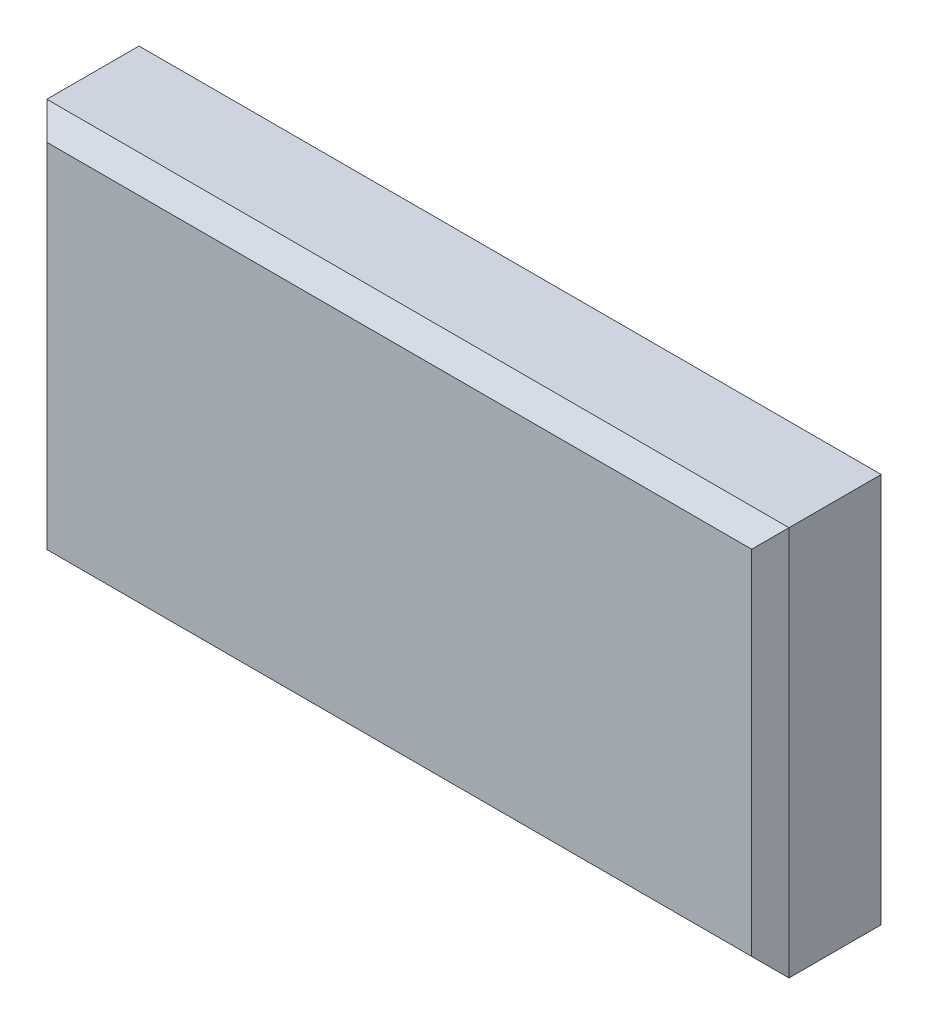
ISO-10303-21;
HEADER;
FILE_DESCRIPTION(('STEP AP214'),'2;1');
FILE_NAME('part.step','',(''),(''),'','','');
FILE_SCHEMA(('AUTOMOTIVE_DESIGN { 1 0 10303 214 1 1 1 1 }'));
ENDSEC;
DATA;
#1=APPLICATION_CONTEXT('core data for automotive mechanical design processes');
#2=APPLICATION_PROTOCOL_DEFINITION('international standard','automotive_design',2000,#1);
#3=PRODUCT_CONTEXT('',#1,'mechanical');
#4=PRODUCT('Part','Part','',(#3));
#5=PRODUCT_RELATED_PRODUCT_CATEGORY('part','',(#4));
#6=PRODUCT_DEFINITION_FORMATION('','',#4);
#7=PRODUCT_DEFINITION_CONTEXT('part definition',#1,'design');
#8=PRODUCT_DEFINITION('design','',#6,#7);
#9=PRODUCT_DEFINITION_SHAPE('','',#8);
#10=(LENGTH_UNIT() NAMED_UNIT(*) SI_UNIT(.MILLI.,.METRE.));
#11=(NAMED_UNIT(*) PLANE_ANGLE_UNIT() SI_UNIT($,.RADIAN.));
#12=(NAMED_UNIT(*) SI_UNIT($,.STERADIAN.) SOLID_ANGLE_UNIT());
#13=UNCERTAINTY_MEASURE_WITH_UNIT(LENGTH_MEASURE(1.E-05),#10,'distance_accuracy_value','');
#14=(GEOMETRIC_REPRESENTATION_CONTEXT(3) GLOBAL_UNCERTAINTY_ASSIGNED_CONTEXT((#13)) GLOBAL_UNIT_ASSIGNED_CONTEXT((#10,
#11,#12)) REPRESENTATION_CONTEXT('',''));
#15=CARTESIAN_POINT('',(0.,0.,0.));
#16=DIRECTION('',(0.,0.,1.));
#17=DIRECTION('',(1.,0.,0.));
#18=AXIS2_PLACEMENT_3D('',#15,#16,#17);
#19=CARTESIAN_POINT('',(-0.0576087295485195,0.0296943708235631,0.0584466470130661));
#20=DIRECTION('',(0.70709318555019,0.,-0.707120376561505));
#21=DIRECTION('',(-0.707120376561505,0.,-0.70709318555019));
#22=AXIS2_PLACEMENT_3D('',#19,#20,#21);
#23=PLANE('',#22);
#24=DIRECTION('',(-0.577364700085791,-0.577343608622065,-0.577342498589959));
#25=VECTOR('',#24,1.);
#26=CARTESIAN_POINT('',(-0.0378130744819627,-0.0098968632184242,0.078241540874178));
#27=LINE('',#26,#25);
#28=CARTESIAN_POINT('',(-0.0547705967619549,-0.0268537660303991,0.0612846706644632));
#29=VERTEX_POINT('',#28);
#30=CARTESIAN_POINT('',(-0.0576087295485195,-0.0296920134132961,0.0584466470130661));
#31=VERTEX_POINT('',#30);
#32=EDGE_CURVE('E62',#29,#31,#27,.T.);
#33=ORIENTED_EDGE('',*,*,#32,.F.);
#34=DIRECTION('',(0.,-1.,0.));
#35=VECTOR('',#34,1.);
#36=CARTESIAN_POINT('',(-0.0547705967619549,0.0296943708235631,0.0612846706644632));
#37=LINE('',#36,#35);
#38=CARTESIAN_POINT('',(-0.0547705967619549,0.0268561198026873,0.0612846706644632));
#39=VERTEX_POINT('',#38);
#40=EDGE_CURVE('E42',#39,#29,#37,.T.);
#41=ORIENTED_EDGE('',*,*,#40,.F.);
#42=DIRECTION('',(0.57736445340867,-0.577344101975042,0.577342251922323));
#43=VECTOR('',#42,1.);
#44=CARTESIAN_POINT('',(-0.0576088023079401,0.0296942253051879,0.0584465742564433));
#45=LINE('',#44,#43);
#46=CARTESIAN_POINT('',(-0.0576087295485195,0.0296943708235631,0.0584464287385345));
#47=VERTEX_POINT('',#46);
#48=EDGE_CURVE('E163',#47,#39,#45,.T.);
#49=ORIENTED_EDGE('',*,*,#48,.F.);
#50=DIRECTION('',(0.,-1.,0.));
#51=VECTOR('',#50,1.);
#52=CARTESIAN_POINT('',(-0.0576087295485195,0.0296943708235631,0.0584466470130661));
#53=LINE('',#52,#51);
#54=EDGE_CURVE('E11',#47,#31,#53,.T.);
#55=ORIENTED_EDGE('',*,*,#54,.T.);
#56=EDGE_LOOP('',(#33,#41,#49,#55));
#57=FACE_BOUND('',#56,.T.);
#58=ADVANCED_FACE('F33',(#57),#23,.F.);
#59=CARTESIAN_POINT('',(-0.0547705967619549,0.0296943708235631,0.0612846706644632));
#60=DIRECTION('',(0.,0.,-1.));
#61=DIRECTION('',(-1.,0.,0.));
#62=AXIS2_PLACEMENT_3D('',#59,#60,#61);
#63=PLANE('',#62);
#64=DIRECTION('',(-1.,0.,0.));
#65=VECTOR('',#64,1.);
#66=CARTESIAN_POINT('',(0.0554131183889695,-0.0268537660303991,0.0612846706644632));
#67=LINE('',#66,#65);
#68=CARTESIAN_POINT('',(0.0525749856024049,-0.0268537660303991,0.0612846706644632));
#69=VERTEX_POINT('',#68);
#70=EDGE_CURVE('E160',#69,#29,#67,.T.);
#71=ORIENTED_EDGE('',*,*,#70,.F.);
#72=DIRECTION('',(0.,-1.,0.));
#73=VECTOR('',#72,1.);
#74=CARTESIAN_POINT('',(0.0525749856024049,0.0296943708235631,0.0612846706644632));
#75=LINE('',#74,#73);
#76=CARTESIAN_POINT('',(0.0525749856024049,0.0268561198026873,0.0612846706644632));
#77=VERTEX_POINT('',#76);
#78=EDGE_CURVE('E151',#77,#69,#75,.T.);
#79=ORIENTED_EDGE('',*,*,#78,.F.);
#80=DIRECTION('',(-1.,0.,0.));
#81=VECTOR('',#80,1.);
#82=CARTESIAN_POINT('',(0.0554131183889695,0.0268561198026873,0.0612846706644632));
#83=LINE('',#82,#81);
#84=EDGE_CURVE('E121',#77,#39,#83,.T.);
#85=ORIENTED_EDGE('',*,*,#84,.T.);
#86=ORIENTED_EDGE('',*,*,#40,.T.);
#87=EDGE_LOOP('',(#71,#79,#85,#86));
#88=FACE_BOUND('',#87,.T.);
#89=ADVANCED_FACE('F158',(#88),#63,.F.);
#90=CARTESIAN_POINT('',(0.0525749856024049,0.0296943708235631,0.0612846706644632));
#91=DIRECTION('',(-0.707120376561505,0.,-0.70709318555019));
#92=DIRECTION('',(-0.70709318555019,0.,0.707120376561505));
#93=AXIS2_PLACEMENT_3D('',#90,#91,#92);
#94=PLANE('',#93);
#95=DIRECTION('',(-0.577335098262098,0.577358409533915,0.577357299473352));
#96=VECTOR('',#95,1.);
#97=CARTESIAN_POINT('',(0.033725836193126,-0.00800385554207493,0.0801345449109281));
#98=LINE('',#97,#96);
#99=CARTESIAN_POINT('',(0.0554131183889695,-0.0296920134132961,0.0584464287385345));
#100=VERTEX_POINT('',#99);
#101=EDGE_CURVE('E165',#100,#69,#98,.T.);
#102=ORIENTED_EDGE('',*,*,#101,.F.);
#103=DIRECTION('',(0.,-1.,0.));
#104=VECTOR('',#103,1.);
#105=CARTESIAN_POINT('',(0.0554131183889695,0.0296943708235631,0.0584464287385345));
#106=LINE('',#105,#104);
#107=CARTESIAN_POINT('',(0.0554131183889695,0.0296943708235631,0.0584464287385345));
#108=VERTEX_POINT('',#107);
#109=EDGE_CURVE('E148',#108,#100,#106,.T.);
#110=ORIENTED_EDGE('',*,*,#109,.F.);
#111=DIRECTION('',(0.577334851584977,0.577358902886893,-0.577357052786745));
#112=VECTOR('',#111,1.);
#113=CARTESIAN_POINT('',(0.0535210581591008,0.027802231771999,0.0603385617268911));
#114=LINE('',#113,#112);
#115=EDGE_CURVE('E164',#77,#108,#114,.T.);
#116=ORIENTED_EDGE('',*,*,#115,.F.);
#117=ORIENTED_EDGE('',*,*,#78,.T.);
#118=EDGE_LOOP('',(#102,#110,#116,#117));
#119=FACE_BOUND('',#118,.T.);
#120=ADVANCED_FACE('F202',(#119),#94,.F.);
#121=CARTESIAN_POINT('',(0.0525749856024049,0.0296943708235631,0.0415685681218747));
#122=DIRECTION('',(-0.707091372818428,0.,0.707122189218915));
#123=DIRECTION('',(0.707122189218915,0.,0.707091372818428));
#124=AXIS2_PLACEMENT_3D('',#121,#122,#123);
#125=PLANE('',#124);
#126=DIRECTION('',(-0.57735063850462,-0.577374690464206,-0.577325477551155));
#127=VECTOR('',#126,1.);
#128=CARTESIAN_POINT('',(0.053521109899527,0.0278022835145807,0.0425146511868792));
#129=LINE('',#128,#127);
#130=CARTESIAN_POINT('',(0.0554131183889695,0.0296943708235631,0.0444065772225503));
#131=VERTEX_POINT('',#130);
#132=CARTESIAN_POINT('',(0.0525749856024049,0.0268561198026873,0.0415685681218747));
#133=VERTEX_POINT('',#132);
#134=EDGE_CURVE('E134',#131,#133,#129,.T.);
#135=ORIENTED_EDGE('',*,*,#134,.F.);
#136=DIRECTION('',(0.,-1.,0.));
#137=VECTOR('',#136,1.);
#138=CARTESIAN_POINT('',(0.0554131183889695,0.0296943708235631,0.0444065772225503));
#139=LINE('',#138,#137);
#140=CARTESIAN_POINT('',(0.0554131183889695,-0.0296920134132961,0.0444065772225503));
#141=VERTEX_POINT('',#140);
#142=EDGE_CURVE('E145',#131,#141,#139,.T.);
#143=ORIENTED_EDGE('',*,*,#142,.T.);
#144=DIRECTION('',(0.577367660203022,-0.577340648463727,0.57734249850775));
#145=VECTOR('',#144,1.);
#146=CARTESIAN_POINT('',(0.0337253529755619,-0.00800501527034117,0.0227197569624342));
#147=LINE('',#146,#145);
#148=CARTESIAN_POINT('',(0.0525749856024049,-0.0268537660303991,0.0415685681218747));
#149=VERTEX_POINT('',#148);
#150=EDGE_CURVE('E105',#149,#141,#147,.T.);
#151=ORIENTED_EDGE('',*,*,#150,.F.);
#152=DIRECTION('',(0.,-1.,0.));
#153=VECTOR('',#152,1.);
#154=CARTESIAN_POINT('',(0.0525749856024049,0.0296943708235631,0.0415685681218747));
#155=LINE('',#154,#153);
#156=EDGE_CURVE('E142',#133,#149,#155,.T.);
#157=ORIENTED_EDGE('',*,*,#156,.F.);
#158=EDGE_LOOP('',(#135,#143,#151,#157));
#159=FACE_BOUND('',#158,.T.);
#160=ADVANCED_FACE('F185',(#159),#125,.F.);
#161=CARTESIAN_POINT('',(-0.0547705967619549,0.0296943708235631,0.0415685681218747));
#162=DIRECTION('',(0.,0.,1.));
#163=DIRECTION('',(1.,0.,0.));
#164=AXIS2_PLACEMENT_3D('',#161,#162,#163);
#165=PLANE('',#164);
#166=DIRECTION('',(-1.,0.,0.));
#167=VECTOR('',#166,1.);
#168=CARTESIAN_POINT('',(0.0554131183889695,0.0268561198026873,0.0415685681218747));
#169=LINE('',#168,#167);
#170=CARTESIAN_POINT('',(-0.054770596761955,0.0268561198026873,0.0415685681218747));
#171=VERTEX_POINT('',#170);
#172=EDGE_CURVE('E68',#133,#171,#169,.T.);
#173=ORIENTED_EDGE('',*,*,#172,.F.);
#174=ORIENTED_EDGE('',*,*,#156,.T.);
#175=DIRECTION('',(-1.,0.,0.));
#176=VECTOR('',#175,1.);
#177=CARTESIAN_POINT('',(0.0554131183889695,-0.0268537660303991,0.0415685681218747));
#178=LINE('',#177,#176);
#179=CARTESIAN_POINT('',(-0.054770596761955,-0.0268537660303991,0.0415685681218747));
#180=VERTEX_POINT('',#179);
#181=EDGE_CURVE('E110',#149,#180,#178,.T.);
#182=ORIENTED_EDGE('',*,*,#181,.T.);
#183=DIRECTION('',(0.,-1.,0.));
#184=VECTOR('',#183,1.);
#185=CARTESIAN_POINT('',(-0.0547705967619549,0.0296943708235631,0.0415685681218747));
#186=LINE('',#185,#184);
#187=EDGE_CURVE('E120',#171,#180,#186,.T.);
#188=ORIENTED_EDGE('',*,*,#187,.F.);
#189=EDGE_LOOP('',(#173,#174,#182,#188));
#190=FACE_BOUND('',#189,.T.);
#191=ADVANCED_FACE('F189',(#190),#165,.F.);
#192=CARTESIAN_POINT('',(-0.0576087295485195,0.0296943708235631,0.0444068245997187));
#193=DIRECTION('',(0.707122189218915,0.,0.707091372818428));
#194=DIRECTION('',(0.707091372818428,0.,-0.707122189218915));
#195=AXIS2_PLACEMENT_3D('',#192,#193,#194);
#196=PLANE('',#195);
#197=DIRECTION('',(-0.57731708985715,0.577391464787886,0.577342250445064));
#198=VECTOR('',#197,1.);
#199=CARTESIAN_POINT('',(-0.0576086470812896,0.0296945357439647,0.0444067421288947));
#200=LINE('',#199,#198);
#201=CARTESIAN_POINT('',(-0.0576087295485195,0.0296943708235631,0.0444068245997187));
#202=VERTEX_POINT('',#201);
#203=EDGE_CURVE('E50',#171,#202,#200,.T.);
#204=ORIENTED_EDGE('',*,*,#203,.F.);
#205=ORIENTED_EDGE('',*,*,#187,.T.);
#206=DIRECTION('',(0.577334111555511,0.577357422787487,-0.577359272885263));
#207=VECTOR('',#206,1.);
#208=CARTESIAN_POINT('',(-0.0378135768621916,-0.00989606145080031,0.0246108092026064));
#209=LINE('',#208,#207);
#210=CARTESIAN_POINT('',(-0.0576087295485195,-0.0296920134132961,0.0444068245997187));
#211=VERTEX_POINT('',#210);
#212=EDGE_CURVE('E102',#211,#180,#209,.T.);
#213=ORIENTED_EDGE('',*,*,#212,.F.);
#214=DIRECTION('',(0.,-1.,0.));
#215=VECTOR('',#214,1.);
#216=CARTESIAN_POINT('',(-0.0576087295485195,0.0296943708235631,0.0444068245997187));
#217=LINE('',#216,#215);
#218=EDGE_CURVE('E117',#202,#211,#217,.T.);
#219=ORIENTED_EDGE('',*,*,#218,.F.);
#220=EDGE_LOOP('',(#204,#205,#213,#219));
#221=FACE_BOUND('',#220,.T.);
#222=ADVANCED_FACE('F116',(#221),#196,.F.);
#223=CARTESIAN_POINT('',(0.,0.0296943708235631,0.));
#224=DIRECTION('',(0.,1.,0.));
#225=DIRECTION('',(0.,0.,1.));
#226=AXIS2_PLACEMENT_3D('',#223,#224,#225);
#227=PLANE('',#226);
#228=DIRECTION('',(0.,0.,-1.));
#229=VECTOR('',#228,1.);
#230=CARTESIAN_POINT('',(0.0554131183889695,0.0296943708235631,0.0444065772225503));
#231=LINE('',#230,#229);
#232=EDGE_CURVE('E129',#108,#131,#231,.T.);
#233=ORIENTED_EDGE('',*,*,#232,.T.);
#234=DIRECTION('',(-1.,0.,0.));
#235=VECTOR('',#234,1.);
#236=CARTESIAN_POINT('',(0.0554131183889695,0.0296943708235631,0.0444065772225503));
#237=LINE('',#236,#235);
#238=EDGE_CURVE('E178',#131,#202,#237,.T.);
#239=ORIENTED_EDGE('',*,*,#238,.T.);
#240=DIRECTION('',(0.,0.,1.));
#241=VECTOR('',#240,1.);
#242=CARTESIAN_POINT('',(-0.0576087295485195,0.0296943708235631,0.0444068245997187));
#243=LINE('',#242,#241);
#244=EDGE_CURVE('E128',#202,#47,#243,.T.);
#245=ORIENTED_EDGE('',*,*,#244,.T.);
#246=DIRECTION('',(-1.,0.,0.));
#247=VECTOR('',#246,1.);
#248=CARTESIAN_POINT('',(0.0554131183889695,0.0296943708235631,0.0584464287385345));
#249=LINE('',#248,#247);
#250=EDGE_CURVE('E179',#108,#47,#249,.T.);
#251=ORIENTED_EDGE('',*,*,#250,.F.);
#252=EDGE_LOOP('',(#233,#239,#245,#251));
#253=FACE_BOUND('',#252,.T.);
#254=ADVANCED_FACE('F177',(#253),#227,.T.);
#255=CARTESIAN_POINT('',(0.,-0.0296920134132961,0.));
#256=DIRECTION('',(0.,1.,0.));
#257=DIRECTION('',(0.,0.,1.));
#258=AXIS2_PLACEMENT_3D('',#255,#256,#257);
#259=PLANE('',#258);
#260=DIRECTION('',(-1.,0.,0.));
#261=VECTOR('',#260,1.);
#262=CARTESIAN_POINT('',(0.0554131183889695,-0.0296920134132961,0.0584464287385345));
#263=LINE('',#262,#261);
#264=EDGE_CURVE('E132',#100,#31,#263,.T.);
#265=ORIENTED_EDGE('',*,*,#264,.T.);
#266=DIRECTION('',(0.,0.,1.));
#267=VECTOR('',#266,1.);
#268=CARTESIAN_POINT('',(-0.0576087295485195,-0.0296920134132961,0.0444068245997187));
#269=LINE('',#268,#267);
#270=EDGE_CURVE('E126',#211,#31,#269,.T.);
#271=ORIENTED_EDGE('',*,*,#270,.F.);
#272=DIRECTION('',(-1.,0.,0.));
#273=VECTOR('',#272,1.);
#274=CARTESIAN_POINT('',(0.0554131183889695,-0.0296920134132961,0.0444068245997187));
#275=LINE('',#274,#273);
#276=EDGE_CURVE('E99',#141,#211,#275,.T.);
#277=ORIENTED_EDGE('',*,*,#276,.F.);
#278=DIRECTION('',(0.,0.,-1.));
#279=VECTOR('',#278,1.);
#280=CARTESIAN_POINT('',(0.0554131183889695,-0.0296920134132961,0.0444065772225503));
#281=LINE('',#280,#279);
#282=EDGE_CURVE('E133',#100,#141,#281,.T.);
#283=ORIENTED_EDGE('',*,*,#282,.F.);
#284=EDGE_LOOP('',(#265,#271,#277,#283));
#285=FACE_BOUND('',#284,.T.);
#286=ADVANCED_FACE('F131',(#285),#259,.F.);
#287=CARTESIAN_POINT('',(-0.0576087295485195,0.0296943708235631,0.0444068245997187));
#288=DIRECTION('',(1.,0.,0.));
#289=DIRECTION('',(0.,0.,-1.));
#290=AXIS2_PLACEMENT_3D('',#287,#288,#289);
#291=PLANE('',#290);
#292=ORIENTED_EDGE('',*,*,#270,.T.);
#293=ORIENTED_EDGE('',*,*,#54,.F.);
#294=ORIENTED_EDGE('',*,*,#244,.F.);
#295=ORIENTED_EDGE('',*,*,#218,.T.);
#296=EDGE_LOOP('',(#292,#293,#294,#295));
#297=FACE_BOUND('',#296,.T.);
#298=ADVANCED_FACE('F35',(#297),#291,.F.);
#299=CARTESIAN_POINT('',(0.0554131183889695,0.0296943708235631,0.0444065772225503));
#300=DIRECTION('',(-1.,0.,0.));
#301=DIRECTION('',(0.,0.,1.));
#302=AXIS2_PLACEMENT_3D('',#299,#300,#301);
#303=PLANE('',#302);
#304=ORIENTED_EDGE('',*,*,#282,.T.);
#305=ORIENTED_EDGE('',*,*,#142,.F.);
#306=ORIENTED_EDGE('',*,*,#232,.F.);
#307=ORIENTED_EDGE('',*,*,#109,.T.);
#308=EDGE_LOOP('',(#304,#305,#306,#307));
#309=FACE_BOUND('',#308,.T.);
#310=ADVANCED_FACE('F182',(#309),#303,.F.);
#311=CARTESIAN_POINT('',(0.0554131183889695,-0.0296920134132961,0.0444068245997187));
#312=DIRECTION('',(0.,-0.707107914118668,-0.707105648252611));
#313=DIRECTION('',(0.,0.707105648252611,-0.707107914118668));
#314=AXIS2_PLACEMENT_3D('',#311,#312,#313);
#315=PLANE('',#314);
#316=ORIENTED_EDGE('',*,*,#150,.T.);
#317=ORIENTED_EDGE('',*,*,#276,.T.);
#318=ORIENTED_EDGE('',*,*,#212,.T.);
#319=ORIENTED_EDGE('',*,*,#181,.F.);
#320=EDGE_LOOP('',(#316,#317,#318,#319));
#321=FACE_BOUND('',#320,.T.);
#322=ADVANCED_FACE('F101',(#321),#315,.T.);
#323=CARTESIAN_POINT('',(0.0554131183889695,-0.0296920134132961,0.0584464287385345));
#324=DIRECTION('',(0.,-0.707106101424661,0.707107460947781));
#325=DIRECTION('',(0.,-0.707107460947781,-0.707106101424661));
#326=AXIS2_PLACEMENT_3D('',#323,#324,#325);
#327=PLANE('',#326);
#328=ORIENTED_EDGE('',*,*,#32,.T.);
#329=ORIENTED_EDGE('',*,*,#264,.F.);
#330=ORIENTED_EDGE('',*,*,#101,.T.);
#331=ORIENTED_EDGE('',*,*,#70,.T.);
#332=EDGE_LOOP('',(#328,#329,#330,#331));
#333=FACE_BOUND('',#332,.T.);
#334=ADVANCED_FACE('F203',(#333),#327,.T.);
#335=CARTESIAN_POINT('',(0.0554131183889695,0.0268561198026873,0.0612846706644632));
#336=DIRECTION('',(0.,0.707105648250433,0.707107914120847));
#337=DIRECTION('',(0.,-0.707107914120847,0.707105648250433));
#338=AXIS2_PLACEMENT_3D('',#335,#336,#337);
#339=PLANE('',#338);
#340=ORIENTED_EDGE('',*,*,#48,.T.);
#341=ORIENTED_EDGE('',*,*,#84,.F.);
#342=ORIENTED_EDGE('',*,*,#115,.T.);
#343=ORIENTED_EDGE('',*,*,#250,.T.);
#344=EDGE_LOOP('',(#340,#341,#342,#343));
#345=FACE_BOUND('',#344,.T.);
#346=ADVANCED_FACE('F198',(#345),#339,.T.);
#347=CARTESIAN_POINT('',(0.0554131183889695,0.0268561198026873,0.0415685681218747));
#348=DIRECTION('',(0.,0.707076643903269,-0.707136917185413));
#349=DIRECTION('',(0.,0.707136917185413,0.707076643903269));
#350=AXIS2_PLACEMENT_3D('',#347,#348,#349);
#351=PLANE('',#350);
#352=ORIENTED_EDGE('',*,*,#134,.T.);
#353=ORIENTED_EDGE('',*,*,#172,.T.);
#354=ORIENTED_EDGE('',*,*,#203,.T.);
#355=ORIENTED_EDGE('',*,*,#238,.F.);
#356=EDGE_LOOP('',(#352,#353,#354,#355));
#357=FACE_BOUND('',#356,.T.);
#358=ADVANCED_FACE('F187',(#357),#351,.T.);
#359=CLOSED_SHELL('',(#58,#89,#120,#160,#191,#222,#254,#286,#298,#310,#322,#334,#346,#358));
#360=MANIFOLD_SOLID_BREP('B2',#359);
#361=ADVANCED_BREP_SHAPE_REPRESENTATION('',(#18,#360),#14);
#362=SHAPE_DEFINITION_REPRESENTATION(#9,#361);
ENDSEC;
END-ISO-10303-21;
